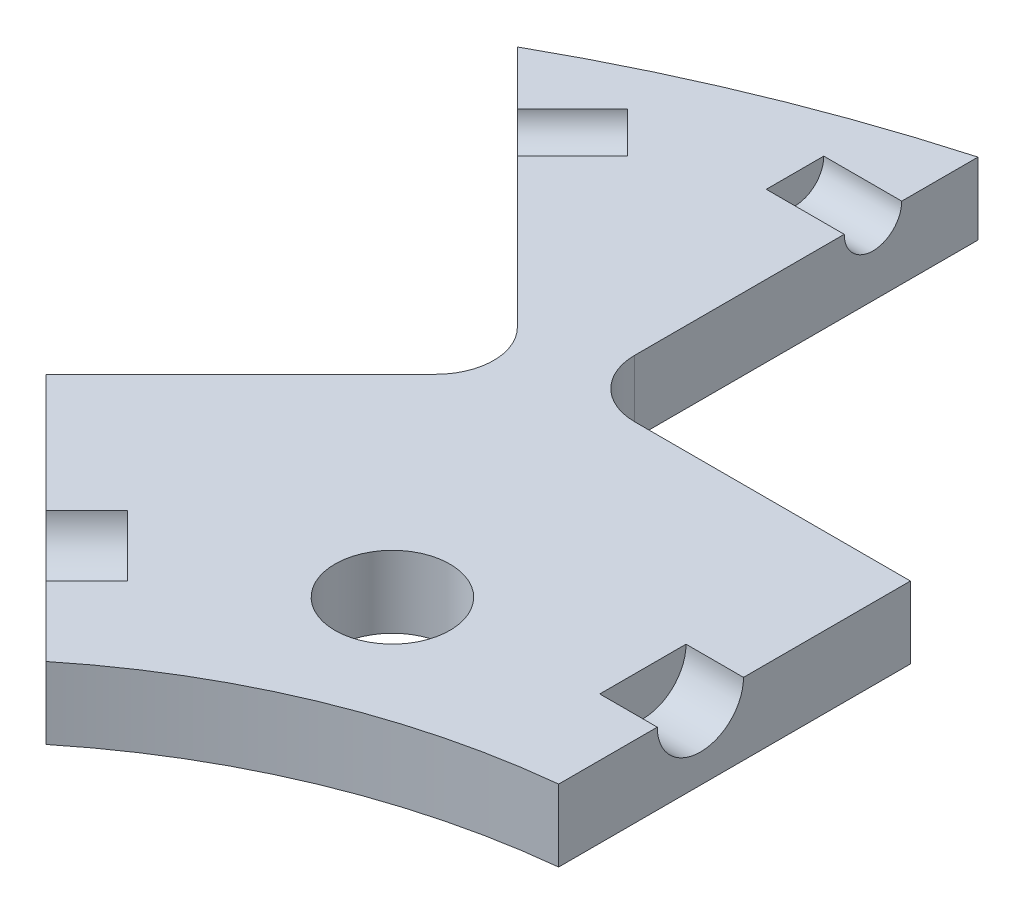
ISO-10303-21;
HEADER;
FILE_DESCRIPTION(('STEP AP214'),'2;1');
FILE_NAME('part.step','',(''),(''),'','','');
FILE_SCHEMA(('AUTOMOTIVE_DESIGN { 1 0 10303 214 1 1 1 1 }'));
ENDSEC;
DATA;
#1=APPLICATION_CONTEXT('core data for automotive mechanical design processes');
#2=APPLICATION_PROTOCOL_DEFINITION('international standard','automotive_design',2000,#1);
#3=PRODUCT_CONTEXT('',#1,'mechanical');
#4=PRODUCT('Part','Part','',(#3));
#5=PRODUCT_RELATED_PRODUCT_CATEGORY('part','',(#4));
#6=PRODUCT_DEFINITION_FORMATION('','',#4);
#7=PRODUCT_DEFINITION_CONTEXT('part definition',#1,'design');
#8=PRODUCT_DEFINITION('design','',#6,#7);
#9=PRODUCT_DEFINITION_SHAPE('','',#8);
#10=(LENGTH_UNIT() NAMED_UNIT(*) SI_UNIT(.MILLI.,.METRE.));
#11=(NAMED_UNIT(*) PLANE_ANGLE_UNIT() SI_UNIT($,.RADIAN.));
#12=(NAMED_UNIT(*) SI_UNIT($,.STERADIAN.) SOLID_ANGLE_UNIT());
#13=UNCERTAINTY_MEASURE_WITH_UNIT(LENGTH_MEASURE(1.E-05),#10,'distance_accuracy_value','');
#14=(GEOMETRIC_REPRESENTATION_CONTEXT(3) GLOBAL_UNCERTAINTY_ASSIGNED_CONTEXT((#13)) GLOBAL_UNIT_ASSIGNED_CONTEXT((#10,
#11,#12)) REPRESENTATION_CONTEXT('',''));
#15=CARTESIAN_POINT('',(0.,0.,0.));
#16=DIRECTION('',(0.,0.,1.));
#17=DIRECTION('',(1.,0.,0.));
#18=AXIS2_PLACEMENT_3D('',#15,#16,#17);
#19=CARTESIAN_POINT('',(-27.2775279677471,0.,-37.3803161039507));
#20=DIRECTION('',(0.707106781186556,0.,-0.707106781186539));
#21=DIRECTION('',(-0.707106781186539,0.,-0.707106781186556));
#22=AXIS2_PLACEMENT_3D('',#19,#20,#21);
#23=PLANE('',#22);
#24=DIRECTION('',(-0.707106781186539,0.,-0.707106781186556));
#25=VECTOR('',#24,1.);
#26=CARTESIAN_POINT('',(5.05139406810146,0.,-5.05139406810134));
#27=LINE('',#26,#25);
#28=CARTESIAN_POINT('',(-25.5937299450467,0.,-35.6965180812502));
#29=VERTEX_POINT('',#28);
#30=CARTESIAN_POINT('',(-28.9613259904475,0.,-39.0641141266512));
#31=VERTEX_POINT('',#30);
#32=EDGE_CURVE('E181',#29,#31,#27,.T.);
#33=ORIENTED_EDGE('',*,*,#32,.T.);
#34=CARTESIAN_POINT('',(-27.2775279677471,0.,-37.3803161039507));
#35=DIRECTION('',(0.707106781186556,0.,-0.707106781186539));
#36=DIRECTION('',(-0.707106781186539,0.,-0.707106781186556));
#37=AXIS2_PLACEMENT_3D('',#34,#35,#36);
#38=CIRCLE('',#37,2.38125);
#39=EDGE_CURVE('E169',#29,#31,#38,.T.);
#40=ORIENTED_EDGE('',*,*,#39,.F.);
#41=EDGE_LOOP('',(#33,#40));
#42=FACE_BOUND('',#41,.T.);
#43=ADVANCED_FACE('F40',(#42),#23,.F.);
#44=CARTESIAN_POINT('',(-29.1983725009799,-3.96875,-56.3536528991695));
#45=DIRECTION('',(0.,1.,0.));
#46=DIRECTION('',(0.,0.,1.));
#47=AXIS2_PLACEMENT_3D('',#44,#45,#46);
#48=CYLINDRICAL_SURFACE('',#47,3.175);
#49=CARTESIAN_POINT('',(-29.1983725009799,0.,-56.3536528991695));
#50=DIRECTION('',(0.,1.,0.));
#51=DIRECTION('',(0.,0.,1.));
#52=AXIS2_PLACEMENT_3D('',#49,#50,#51);
#53=CIRCLE('',#52,3.175);
#54=CARTESIAN_POINT('',(-26.9533084707125,0.,-58.5987169294368));
#55=VERTEX_POINT('',#54);
#56=CARTESIAN_POINT('',(-26.9533084707126,0.,-54.1085888689022));
#57=VERTEX_POINT('',#56);
#58=EDGE_CURVE('E304',#55,#57,#53,.F.);
#59=ORIENTED_EDGE('',*,*,#58,.F.);
#60=DIRECTION('',(0.,1.,0.));
#61=VECTOR('',#60,1.);
#62=CARTESIAN_POINT('',(-26.9533084707125,-3.96875,-58.5987169294368));
#63=LINE('',#62,#61);
#64=CARTESIAN_POINT('',(-26.9533084707125,-3.96875,-58.5987169294368));
#65=VERTEX_POINT('',#64);
#66=EDGE_CURVE('E224',#65,#55,#63,.T.);
#67=ORIENTED_EDGE('',*,*,#66,.F.);
#68=CARTESIAN_POINT('',(-29.1983725009799,-3.96875,-56.3536528991695));
#69=DIRECTION('',(0.,1.,0.));
#70=DIRECTION('',(0.707106781186539,0.,0.707106781186556));
#71=AXIS2_PLACEMENT_3D('',#68,#69,#70);
#72=CIRCLE('',#71,3.175);
#73=CARTESIAN_POINT('',(-26.9533084707126,-3.96875,-54.1085888689022));
#74=VERTEX_POINT('',#73);
#75=EDGE_CURVE('E261',#74,#65,#72,.T.);
#76=ORIENTED_EDGE('',*,*,#75,.F.);
#77=DIRECTION('',(0.,1.,0.));
#78=VECTOR('',#77,1.);
#79=CARTESIAN_POINT('',(-26.9533084707126,-3.96875,-54.1085888689022));
#80=LINE('',#79,#78);
#81=EDGE_CURVE('E188',#74,#57,#80,.T.);
#82=ORIENTED_EDGE('',*,*,#81,.T.);
#83=EDGE_LOOP('',(#59,#67,#76,#82));
#84=FACE_BOUND('',#83,.T.);
#85=ADVANCED_FACE('F369',(#84),#48,.F.);
#86=CARTESIAN_POINT('',(-33.2179673918339,0.,-70.9530036125678));
#87=DIRECTION('',(0.707106781186556,0.,-0.707106781186539));
#88=DIRECTION('',(-0.707106781186539,0.,-0.707106781186556));
#89=AXIS2_PLACEMENT_3D('',#86,#87,#88);
#90=PLANE('',#89);
#91=DIRECTION('',(0.707106781186539,0.,0.707106781186556));
#92=VECTOR('',#91,1.);
#93=CARTESIAN_POINT('',(-33.2179673918339,0.,-70.9530036125678));
#94=LINE('',#93,#92);
#95=CARTESIAN_POINT('',(-34.3404994069676,0.,-72.0755356277014));
#96=VERTEX_POINT('',#95);
#97=CARTESIAN_POINT('',(-32.0954353767003,0.,-69.8304715974341));
#98=VERTEX_POINT('',#97);
#99=EDGE_CURVE('E294',#96,#98,#94,.T.);
#100=ORIENTED_EDGE('',*,*,#99,.F.);
#101=CARTESIAN_POINT('',(-33.2179673918339,0.,-70.9530036125678));
#102=DIRECTION('',(0.707106781186556,0.,-0.707106781186539));
#103=DIRECTION('',(-0.707106781186539,0.,-0.707106781186556));
#104=AXIS2_PLACEMENT_3D('',#101,#102,#103);
#105=CIRCLE('',#104,1.5875);
#106=EDGE_CURVE('E195',#98,#96,#105,.T.);
#107=ORIENTED_EDGE('',*,*,#106,.F.);
#108=EDGE_LOOP('',(#100,#107));
#109=FACE_BOUND('',#108,.T.);
#110=ADVANCED_FACE('F416',(#109),#90,.F.);
#111=CARTESIAN_POINT('',(-70.953003612567,0.,-33.2179673918357));
#112=DIRECTION('',(0.707106781186556,0.,-0.707106781186539));
#113=DIRECTION('',(-0.707106781186539,0.,-0.707106781186556));
#114=AXIS2_PLACEMENT_3D('',#111,#112,#113);
#115=CYLINDRICAL_SURFACE('',#114,1.5875);
#116=DIRECTION('',(0.707106781186556,0.,-0.707106781186539));
#117=VECTOR('',#116,1.);
#118=CARTESIAN_POINT('',(-69.8304715974334,0.,-32.095435376702));
#119=LINE('',#118,#117);
#120=CARTESIAN_POINT('',(-35.140249257705,0.,-66.7856577164295));
#121=VERTEX_POINT('',#120);
#122=EDGE_CURVE('E298',#98,#121,#119,.F.);
#123=ORIENTED_EDGE('',*,*,#122,.F.);
#124=ORIENTED_EDGE('',*,*,#106,.T.);
#125=DIRECTION('',(0.707106781186556,0.,-0.707106781186539));
#126=VECTOR('',#125,1.);
#127=CARTESIAN_POINT('',(-72.0755356277006,0.,-34.3404994069693));
#128=LINE('',#127,#126);
#129=CARTESIAN_POINT('',(-37.3853132879723,0.,-69.0307217466968));
#130=VERTEX_POINT('',#129);
#131=EDGE_CURVE('E291',#130,#96,#128,.T.);
#132=ORIENTED_EDGE('',*,*,#131,.F.);
#133=CARTESIAN_POINT('',(-36.2627812728387,0.,-67.9081897315631));
#134=DIRECTION('',(0.707106781186557,0.,-0.707106781186538));
#135=DIRECTION('',(-0.707106781186538,0.,-0.707106781186557));
#136=AXIS2_PLACEMENT_3D('',#133,#134,#135);
#137=CIRCLE('',#136,1.5875);
#138=EDGE_CURVE('E219',#121,#130,#137,.T.);
#139=ORIENTED_EDGE('',*,*,#138,.F.);
#140=EDGE_LOOP('',(#123,#124,#132,#139));
#141=FACE_BOUND('',#140,.T.);
#142=ADVANCED_FACE('F475',(#141),#115,.F.);
#143=CARTESIAN_POINT('',(-40.3635332391684,-3.96875,-72.008941697893));
#144=DIRECTION('',(0.707106781186557,0.,-0.707106781186538));
#145=DIRECTION('',(-0.707106781186538,0.,-0.707106781186557));
#146=AXIS2_PLACEMENT_3D('',#143,#144,#145);
#147=PLANE('',#146);
#148=DIRECTION('',(0.707106781186538,0.,0.707106781186557));
#149=VECTOR('',#148,1.);
#150=CARTESIAN_POINT('',(-40.3635332391684,0.,-72.008941697893));
#151=LINE('',#150,#149);
#152=CARTESIAN_POINT('',(-40.3635332391684,0.,-72.008941697893));
#153=VERTEX_POINT('',#152);
#154=EDGE_CURVE('E295',#153,#130,#151,.T.);
#155=ORIENTED_EDGE('',*,*,#154,.F.);
#156=DIRECTION('',(0.,1.,0.));
#157=VECTOR('',#156,1.);
#158=CARTESIAN_POINT('',(-40.3635332391684,-3.96875,-72.008941697893));
#159=LINE('',#158,#157);
#160=CARTESIAN_POINT('',(-40.3635332391684,-3.96875,-72.008941697893));
#161=VERTEX_POINT('',#160);
#162=EDGE_CURVE('E253',#161,#153,#159,.T.);
#163=ORIENTED_EDGE('',*,*,#162,.F.);
#164=DIRECTION('',(-0.707106781186538,0.,-0.707106781186557));
#165=VECTOR('',#164,1.);
#166=CARTESIAN_POINT('',(-40.3635332391684,-3.96875,-72.008941697893));
#167=LINE('',#166,#165);
#168=EDGE_CURVE('E249',#65,#161,#167,.T.);
#169=ORIENTED_EDGE('',*,*,#168,.F.);
#170=ORIENTED_EDGE('',*,*,#66,.T.);
#171=EDGE_CURVE('E301',#121,#55,#151,.T.);
#172=ORIENTED_EDGE('',*,*,#171,.F.);
#173=ORIENTED_EDGE('',*,*,#138,.T.);
#174=EDGE_LOOP('',(#155,#163,#169,#170,#172,#173));
#175=FACE_BOUND('',#174,.T.);
#176=ADVANCED_FACE('F373',(#175),#147,.F.);
#177=CARTESIAN_POINT('',(0.,3.96875,0.));
#178=DIRECTION('',(0.,-1.,0.));
#179=DIRECTION('',(0.,0.,-1.));
#180=AXIS2_PLACEMENT_3D('',#177,#178,#179);
#181=CYLINDRICAL_SURFACE('',#180,82.55);
#182=CARTESIAN_POINT('',(0.,0.,0.));
#183=DIRECTION('',(0.,1.,0.));
#184=DIRECTION('',(0.,0.,1.));
#185=AXIS2_PLACEMENT_3D('',#182,#183,#184);
#186=CIRCLE('',#185,82.55);
#187=CARTESIAN_POINT('',(-22.3766829145813,0.,-79.4593390467117));
#188=VERTEX_POINT('',#187);
#189=EDGE_CURVE('E44',#188,#153,#186,.T.);
#190=ORIENTED_EDGE('',*,*,#189,.F.);
#191=DIRECTION('',(0.,1.,0.));
#192=VECTOR('',#191,1.);
#193=CARTESIAN_POINT('',(-22.3766829145813,-3.96875,-79.4593390467117));
#194=LINE('',#193,#192);
#195=CARTESIAN_POINT('',(-22.3766829145813,-3.96875,-79.4593390467117));
#196=VERTEX_POINT('',#195);
#197=EDGE_CURVE('E225',#196,#188,#194,.T.);
#198=ORIENTED_EDGE('',*,*,#197,.F.);
#199=CARTESIAN_POINT('',(0.,-3.96875,0.));
#200=DIRECTION('',(0.,1.,0.));
#201=DIRECTION('',(0.,0.,1.));
#202=AXIS2_PLACEMENT_3D('',#199,#200,#201);
#203=CIRCLE('',#202,82.55);
#204=EDGE_CURVE('E223',#196,#161,#203,.T.);
#205=ORIENTED_EDGE('',*,*,#204,.T.);
#206=ORIENTED_EDGE('',*,*,#162,.T.);
#207=EDGE_LOOP('',(#190,#198,#205,#206));
#208=FACE_BOUND('',#207,.T.);
#209=ADVANCED_FACE('F376',(#208),#181,.T.);
#210=CARTESIAN_POINT('',(-26.6827,0.,-73.66));
#211=DIRECTION('',(1.,0.,0.));
#212=DIRECTION('',(0.,0.,-1.));
#213=AXIS2_PLACEMENT_3D('',#210,#211,#212);
#214=PLANE('',#213);
#215=CARTESIAN_POINT('',(-26.6827,0.,-73.66));
#216=DIRECTION('',(1.,0.,0.));
#217=DIRECTION('',(0.,0.,-1.));
#218=AXIS2_PLACEMENT_3D('',#215,#216,#217);
#219=CIRCLE('',#218,1.5875);
#220=CARTESIAN_POINT('',(-26.6827,0.,-72.0725));
#221=VERTEX_POINT('',#220);
#222=CARTESIAN_POINT('',(-26.6827,0.,-75.2475));
#223=VERTEX_POINT('',#222);
#224=EDGE_CURVE('E256',#221,#223,#219,.T.);
#225=ORIENTED_EDGE('',*,*,#224,.T.);
#226=DIRECTION('',(0.,0.,1.));
#227=VECTOR('',#226,1.);
#228=CARTESIAN_POINT('',(-26.6827,0.,-73.66));
#229=LINE('',#228,#227);
#230=EDGE_CURVE('E230',#223,#221,#229,.T.);
#231=ORIENTED_EDGE('',*,*,#230,.T.);
#232=EDGE_LOOP('',(#225,#231));
#233=FACE_BOUND('',#232,.T.);
#234=ADVANCED_FACE('F423',(#233),#214,.T.);
#235=CARTESIAN_POINT('',(-26.6827,0.,-73.66));
#236=DIRECTION('',(1.,0.,0.));
#237=DIRECTION('',(0.,0.,-1.));
#238=AXIS2_PLACEMENT_3D('',#235,#236,#237);
#239=CYLINDRICAL_SURFACE('',#238,1.5875);
#240=DIRECTION('',(1.,0.,0.));
#241=VECTOR('',#240,1.);
#242=CARTESIAN_POINT('',(-26.6827,0.,-72.0725));
#243=LINE('',#242,#241);
#244=CARTESIAN_POINT('',(-22.3766829145813,0.,-72.0725));
#245=VERTEX_POINT('',#244);
#246=EDGE_CURVE('E283',#245,#221,#243,.F.);
#247=ORIENTED_EDGE('',*,*,#246,.F.);
#248=CARTESIAN_POINT('',(-22.3766829145813,0.,-73.66));
#249=DIRECTION('',(-1.,0.,0.));
#250=DIRECTION('',(0.,0.,1.));
#251=AXIS2_PLACEMENT_3D('',#248,#249,#250);
#252=CIRCLE('',#251,1.5875);
#253=CARTESIAN_POINT('',(-22.3766829145813,0.,-75.2475));
#254=VERTEX_POINT('',#253);
#255=EDGE_CURVE('E229',#254,#245,#252,.T.);
#256=ORIENTED_EDGE('',*,*,#255,.F.);
#257=DIRECTION('',(1.,0.,0.));
#258=VECTOR('',#257,1.);
#259=CARTESIAN_POINT('',(-26.6827,0.,-75.2475));
#260=LINE('',#259,#258);
#261=EDGE_CURVE('E282',#223,#254,#260,.T.);
#262=ORIENTED_EDGE('',*,*,#261,.F.);
#263=ORIENTED_EDGE('',*,*,#224,.F.);
#264=EDGE_LOOP('',(#247,#256,#262,#263));
#265=FACE_BOUND('',#264,.T.);
#266=ADVANCED_FACE('F420',(#265),#239,.F.);
#267=CARTESIAN_POINT('',(-22.3766829145813,-3.96875,-79.4593390467117));
#268=DIRECTION('',(-1.,0.,0.));
#269=DIRECTION('',(0.,0.,1.));
#270=AXIS2_PLACEMENT_3D('',#267,#268,#269);
#271=PLANE('',#270);
#272=DIRECTION('',(0.,0.,-1.));
#273=VECTOR('',#272,1.);
#274=CARTESIAN_POINT('',(-22.3766829145813,0.,-79.4593390467117));
#275=LINE('',#274,#273);
#276=CARTESIAN_POINT('',(-22.3766829145813,0.,-60.4944173046896));
#277=VERTEX_POINT('',#276);
#278=EDGE_CURVE('E278',#277,#245,#275,.T.);
#279=ORIENTED_EDGE('',*,*,#278,.F.);
#280=DIRECTION('',(0.,1.,0.));
#281=VECTOR('',#280,1.);
#282=CARTESIAN_POINT('',(-22.3766829145813,-3.96875,-60.4944173046896));
#283=LINE('',#282,#281);
#284=CARTESIAN_POINT('',(-22.3766829145813,-3.96875,-60.4944173046896));
#285=VERTEX_POINT('',#284);
#286=EDGE_CURVE('E231',#285,#277,#283,.T.);
#287=ORIENTED_EDGE('',*,*,#286,.F.);
#288=DIRECTION('',(0.,0.,1.));
#289=VECTOR('',#288,1.);
#290=CARTESIAN_POINT('',(-22.3766829145813,-3.96875,-79.4593390467117));
#291=LINE('',#290,#289);
#292=EDGE_CURVE('E245',#196,#285,#291,.T.);
#293=ORIENTED_EDGE('',*,*,#292,.F.);
#294=ORIENTED_EDGE('',*,*,#197,.T.);
#295=EDGE_CURVE('E279',#254,#188,#275,.T.);
#296=ORIENTED_EDGE('',*,*,#295,.F.);
#297=ORIENTED_EDGE('',*,*,#255,.T.);
#298=EDGE_LOOP('',(#279,#287,#293,#294,#296,#297));
#299=FACE_BOUND('',#298,.T.);
#300=ADVANCED_FACE('F381',(#299),#271,.F.);
#301=CARTESIAN_POINT('',(-19.2016829145813,-3.96875,-60.4944173046896));
#302=DIRECTION('',(0.,1.,0.));
#303=DIRECTION('',(0.,0.,1.));
#304=AXIS2_PLACEMENT_3D('',#301,#302,#303);
#305=CYLINDRICAL_SURFACE('',#304,3.175);
#306=CARTESIAN_POINT('',(-19.2016829145813,0.,-60.4944173046896));
#307=DIRECTION('',(0.,1.,0.));
#308=DIRECTION('',(0.,0.,1.));
#309=AXIS2_PLACEMENT_3D('',#306,#307,#308);
#310=CIRCLE('',#309,3.175);
#311=CARTESIAN_POINT('',(-19.2016829145813,0.,-57.3194173046896));
#312=VERTEX_POINT('',#311);
#313=EDGE_CURVE('E275',#312,#277,#310,.F.);
#314=ORIENTED_EDGE('',*,*,#313,.F.);
#315=DIRECTION('',(0.,1.,0.));
#316=VECTOR('',#315,1.);
#317=CARTESIAN_POINT('',(-19.2016829145813,-3.96875,-57.3194173046896));
#318=LINE('',#317,#316);
#319=CARTESIAN_POINT('',(-19.2016829145813,-3.96875,-57.3194173046896));
#320=VERTEX_POINT('',#319);
#321=EDGE_CURVE('E236',#320,#312,#318,.T.);
#322=ORIENTED_EDGE('',*,*,#321,.F.);
#323=CARTESIAN_POINT('',(-19.2016829145813,-3.96875,-60.4944173046896));
#324=DIRECTION('',(0.,1.,0.));
#325=DIRECTION('',(0.,0.,-1.));
#326=AXIS2_PLACEMENT_3D('',#323,#324,#325);
#327=CIRCLE('',#326,3.175);
#328=EDGE_CURVE('E241',#285,#320,#327,.T.);
#329=ORIENTED_EDGE('',*,*,#328,.F.);
#330=ORIENTED_EDGE('',*,*,#286,.T.);
#331=EDGE_LOOP('',(#314,#322,#329,#330));
#332=FACE_BOUND('',#331,.T.);
#333=ADVANCED_FACE('F385',(#332),#305,.F.);
#334=CARTESIAN_POINT('',(-7.14375,0.,-45.72));
#335=DIRECTION('',(1.,0.,0.));
#336=DIRECTION('',(0.,0.,-1.));
#337=AXIS2_PLACEMENT_3D('',#334,#335,#336);
#338=PLANE('',#337);
#339=CARTESIAN_POINT('',(-7.14375,0.,-45.72));
#340=DIRECTION('',(1.,0.,0.));
#341=DIRECTION('',(0.,0.,-1.));
#342=AXIS2_PLACEMENT_3D('',#339,#340,#341);
#343=CIRCLE('',#342,2.38125);
#344=CARTESIAN_POINT('',(-7.14375,0.,-43.33875));
#345=VERTEX_POINT('',#344);
#346=CARTESIAN_POINT('',(-7.14375,0.,-48.10125));
#347=VERTEX_POINT('',#346);
#348=EDGE_CURVE('E235',#345,#347,#343,.T.);
#349=ORIENTED_EDGE('',*,*,#348,.T.);
#350=DIRECTION('',(0.,0.,-1.));
#351=VECTOR('',#350,1.);
#352=CARTESIAN_POINT('',(-7.14375,0.,0.));
#353=LINE('',#352,#351);
#354=EDGE_CURVE('E208',#345,#347,#353,.T.);
#355=ORIENTED_EDGE('',*,*,#354,.F.);
#356=EDGE_LOOP('',(#349,#355));
#357=FACE_BOUND('',#356,.T.);
#358=ADVANCED_FACE('F400',(#357),#338,.T.);
#359=CARTESIAN_POINT('',(-7.14375,0.,-45.72));
#360=DIRECTION('',(1.,0.,0.));
#361=DIRECTION('',(0.,0.,-1.));
#362=AXIS2_PLACEMENT_3D('',#359,#360,#361);
#363=CYLINDRICAL_SURFACE('',#362,2.38125);
#364=DIRECTION('',(1.,0.,0.));
#365=VECTOR('',#364,1.);
#366=CARTESIAN_POINT('',(-7.14375,0.,-43.33875));
#367=LINE('',#366,#365);
#368=CARTESIAN_POINT('',(-3.96875,0.,-43.33875));
#369=VERTEX_POINT('',#368);
#370=EDGE_CURVE('E326',#345,#369,#367,.T.);
#371=ORIENTED_EDGE('',*,*,#370,.T.);
#372=CARTESIAN_POINT('',(-3.96875,0.,-45.72));
#373=DIRECTION('',(-1.,0.,0.));
#374=DIRECTION('',(0.,0.,1.));
#375=AXIS2_PLACEMENT_3D('',#372,#373,#374);
#376=CIRCLE('',#375,2.38125);
#377=CARTESIAN_POINT('',(-3.96875,0.,-48.10125));
#378=VERTEX_POINT('',#377);
#379=EDGE_CURVE('E213',#378,#369,#376,.T.);
#380=ORIENTED_EDGE('',*,*,#379,.F.);
#381=DIRECTION('',(1.,0.,0.));
#382=VECTOR('',#381,1.);
#383=CARTESIAN_POINT('',(-7.14375,0.,-48.10125));
#384=LINE('',#383,#382);
#385=EDGE_CURVE('E315',#378,#347,#384,.F.);
#386=ORIENTED_EDGE('',*,*,#385,.T.);
#387=ORIENTED_EDGE('',*,*,#348,.F.);
#388=EDGE_LOOP('',(#371,#380,#386,#387));
#389=FACE_BOUND('',#388,.T.);
#390=ADVANCED_FACE('F398',(#389),#363,.F.);
#391=CARTESIAN_POINT('',(19.2016829145813,-3.96875,-57.3194173046896));
#392=DIRECTION('',(0.,0.,1.));
#393=DIRECTION('',(1.,0.,0.));
#394=AXIS2_PLACEMENT_3D('',#391,#392,#393);
#395=PLANE('',#394);
#396=DIRECTION('',(-1.,0.,0.));
#397=VECTOR('',#396,1.);
#398=CARTESIAN_POINT('',(19.2016829145813,0.,-57.3194173046896));
#399=LINE('',#398,#397);
#400=CARTESIAN_POINT('',(-3.96875,0.,-57.3194173046896));
#401=VERTEX_POINT('',#400);
#402=EDGE_CURVE('E212',#401,#312,#399,.T.);
#403=ORIENTED_EDGE('',*,*,#402,.F.);
#404=DIRECTION('',(0.,-1.,0.));
#405=VECTOR('',#404,1.);
#406=CARTESIAN_POINT('',(-3.96875,-3.96875,-57.3194173046896));
#407=LINE('',#406,#405);
#408=CARTESIAN_POINT('',(-3.96875,-3.96875,-57.3194173046896));
#409=VERTEX_POINT('',#408);
#410=EDGE_CURVE('E240',#401,#409,#407,.T.);
#411=ORIENTED_EDGE('',*,*,#410,.T.);
#412=DIRECTION('',(1.,0.,0.));
#413=VECTOR('',#412,1.);
#414=CARTESIAN_POINT('',(19.2016829145813,-3.96875,-57.3194173046896));
#415=LINE('',#414,#413);
#416=EDGE_CURVE('E51',#320,#409,#415,.T.);
#417=ORIENTED_EDGE('',*,*,#416,.F.);
#418=ORIENTED_EDGE('',*,*,#321,.T.);
#419=EDGE_LOOP('',(#403,#411,#417,#418));
#420=FACE_BOUND('',#419,.T.);
#421=ADVANCED_FACE('F389',(#420),#395,.F.);
#422=CARTESIAN_POINT('',(-26.9533084707126,-3.96875,-54.1085888689022));
#423=DIRECTION('',(0.707106781186539,0.,0.707106781186556));
#424=DIRECTION('',(0.707106781186556,0.,-0.707106781186539));
#425=AXIS2_PLACEMENT_3D('',#422,#423,#424);
#426=PLANE('',#425);
#427=DIRECTION('',(0.707106781186556,0.,-0.707106781186539));
#428=VECTOR('',#427,1.);
#429=CARTESIAN_POINT('',(-26.9533084707126,-3.96875,-54.1085888689022));
#430=LINE('',#429,#428);
#431=CARTESIAN_POINT('',(-37.7246186319729,-3.96875,-43.3372787076421));
#432=VERTEX_POINT('',#431);
#433=EDGE_CURVE('E265',#432,#74,#430,.T.);
#434=ORIENTED_EDGE('',*,*,#433,.F.);
#435=DIRECTION('',(0.,1.,0.));
#436=VECTOR('',#435,1.);
#437=CARTESIAN_POINT('',(-37.7246186319729,-3.96875,-43.3372787076421));
#438=LINE('',#437,#436);
#439=CARTESIAN_POINT('',(-37.7246186319729,0.,-43.3372787076421));
#440=VERTEX_POINT('',#439);
#441=EDGE_CURVE('E177',#432,#440,#438,.T.);
#442=ORIENTED_EDGE('',*,*,#441,.T.);
#443=DIRECTION('',(-0.707106781186556,0.,0.707106781186539));
#444=VECTOR('',#443,1.);
#445=CARTESIAN_POINT('',(-26.9533084707126,0.,-54.1085888689022));
#446=LINE('',#445,#444);
#447=EDGE_CURVE('E307',#57,#440,#446,.T.);
#448=ORIENTED_EDGE('',*,*,#447,.F.);
#449=ORIENTED_EDGE('',*,*,#81,.F.);
#450=EDGE_LOOP('',(#434,#442,#448,#449));
#451=FACE_BOUND('',#450,.T.);
#452=ADVANCED_FACE('F363',(#451),#426,.F.);
#453=CARTESIAN_POINT('',(-37.38031610395,0.,-27.277527967748));
#454=DIRECTION('',(0.707106781186556,0.,-0.707106781186539));
#455=DIRECTION('',(-0.707106781186539,0.,-0.707106781186556));
#456=AXIS2_PLACEMENT_3D('',#453,#454,#455);
#457=CYLINDRICAL_SURFACE('',#456,2.38125);
#458=DIRECTION('',(0.707106781186556,0.,-0.707106781186539));
#459=VECTOR('',#458,1.);
#460=CARTESIAN_POINT('',(-35.6965180812496,0.,-25.5937299450475));
#461=LINE('',#460,#459);
#462=CARTESIAN_POINT('',(-27.838793975314,0.,-33.4514540509829));
#463=VERTEX_POINT('',#462);
#464=EDGE_CURVE('E166',#463,#29,#461,.T.);
#465=ORIENTED_EDGE('',*,*,#464,.T.);
#466=ORIENTED_EDGE('',*,*,#39,.T.);
#467=DIRECTION('',(0.707106781186556,0.,-0.707106781186539));
#468=VECTOR('',#467,1.);
#469=CARTESIAN_POINT('',(-39.0641141266505,0.,-28.9613259904485));
#470=LINE('',#469,#468);
#471=CARTESIAN_POINT('',(-31.2063900207149,0.,-36.8190500963839));
#472=VERTEX_POINT('',#471);
#473=EDGE_CURVE('E183',#31,#472,#470,.F.);
#474=ORIENTED_EDGE('',*,*,#473,.T.);
#475=CARTESIAN_POINT('',(-29.5225919980144,0.,-35.1352520736834));
#476=DIRECTION('',(0.707106781186556,0.,-0.707106781186539));
#477=DIRECTION('',(-0.707106781186539,0.,-0.707106781186556));
#478=AXIS2_PLACEMENT_3D('',#475,#476,#477);
#479=CIRCLE('',#478,2.38125);
#480=EDGE_CURVE('E172',#463,#472,#479,.T.);
#481=ORIENTED_EDGE('',*,*,#480,.F.);
#482=EDGE_LOOP('',(#465,#466,#474,#481));
#483=FACE_BOUND('',#482,.T.);
#484=ADVANCED_FACE('F168',(#483),#457,.F.);
#485=CARTESIAN_POINT('',(-15.2739783293003,-3.96875,-20.886638404969));
#486=DIRECTION('',(0.707106781186556,0.,-0.707106781186539));
#487=DIRECTION('',(-0.707106781186539,0.,-0.707106781186556));
#488=AXIS2_PLACEMENT_3D('',#485,#486,#487);
#489=PLANE('',#488);
#490=DIRECTION('',(-0.707106781186539,0.,-0.707106781186556));
#491=VECTOR('',#490,1.);
#492=CARTESIAN_POINT('',(-15.2739783293003,-3.96875,-20.886638404969));
#493=LINE('',#492,#491);
#494=CARTESIAN_POINT('',(-23.9878766441845,-3.96875,-29.6005367198534));
#495=VERTEX_POINT('',#494);
#496=EDGE_CURVE('E330',#495,#432,#493,.T.);
#497=ORIENTED_EDGE('',*,*,#496,.F.);
#498=DIRECTION('',(0.,1.,0.));
#499=VECTOR('',#498,1.);
#500=CARTESIAN_POINT('',(-23.9878766441845,-3.96875,-29.6005367198534));
#501=LINE('',#500,#499);
#502=CARTESIAN_POINT('',(-23.9878766441845,0.,-29.6005367198534));
#503=VERTEX_POINT('',#502);
#504=EDGE_CURVE('E67',#495,#503,#501,.T.);
#505=ORIENTED_EDGE('',*,*,#504,.T.);
#506=DIRECTION('',(-0.707106781186539,0.,-0.707106781186556));
#507=VECTOR('',#506,1.);
#508=CARTESIAN_POINT('',(2.80633003783414,0.,-2.80633003783407));
#509=LINE('',#508,#507);
#510=EDGE_CURVE('E205',#503,#463,#509,.T.);
#511=ORIENTED_EDGE('',*,*,#510,.T.);
#512=ORIENTED_EDGE('',*,*,#480,.T.);
#513=EDGE_CURVE('E204',#472,#440,#509,.T.);
#514=ORIENTED_EDGE('',*,*,#513,.T.);
#515=ORIENTED_EDGE('',*,*,#441,.F.);
#516=EDGE_LOOP('',(#497,#505,#511,#512,#514,#515));
#517=FACE_BOUND('',#516,.T.);
#518=ADVANCED_FACE('F358',(#517),#489,.F.);
#519=CARTESIAN_POINT('',(-3.96875,-3.96875,-25.5694173046896));
#520=DIRECTION('',(-1.,0.,0.));
#521=DIRECTION('',(0.,0.,1.));
#522=AXIS2_PLACEMENT_3D('',#519,#520,#521);
#523=PLANE('',#522);
#524=DIRECTION('',(0.,0.,1.));
#525=VECTOR('',#524,1.);
#526=CARTESIAN_POINT('',(-3.96875,0.,0.));
#527=LINE('',#526,#525);
#528=CARTESIAN_POINT('',(-3.96875,0.,-37.892730482739));
#529=VERTEX_POINT('',#528);
#530=EDGE_CURVE('E218',#369,#529,#527,.T.);
#531=ORIENTED_EDGE('',*,*,#530,.T.);
#532=DIRECTION('',(0.,1.,0.));
#533=VECTOR('',#532,1.);
#534=CARTESIAN_POINT('',(-3.96875,-3.96875,-37.892730482739));
#535=LINE('',#534,#533);
#536=CARTESIAN_POINT('',(-3.96875,-3.96875,-37.892730482739));
#537=VERTEX_POINT('',#536);
#538=EDGE_CURVE('E58',#529,#537,#535,.F.);
#539=ORIENTED_EDGE('',*,*,#538,.T.);
#540=DIRECTION('',(0.,0.,1.));
#541=VECTOR('',#540,1.);
#542=CARTESIAN_POINT('',(-3.96875,-3.96875,-25.5694173046896));
#543=LINE('',#542,#541);
#544=EDGE_CURVE('E311',#409,#537,#543,.T.);
#545=ORIENTED_EDGE('',*,*,#544,.F.);
#546=ORIENTED_EDGE('',*,*,#410,.F.);
#547=EDGE_CURVE('E214',#401,#378,#527,.T.);
#548=ORIENTED_EDGE('',*,*,#547,.T.);
#549=ORIENTED_EDGE('',*,*,#379,.T.);
#550=EDGE_LOOP('',(#531,#539,#545,#546,#548,#549));
#551=FACE_BOUND('',#550,.T.);
#552=ADVANCED_FACE('F393',(#551),#523,.F.);
#553=CARTESIAN_POINT('',(0.,0.,0.));
#554=DIRECTION('',(0.,1.,0.));
#555=DIRECTION('',(0.,0.,1.));
#556=AXIS2_PLACEMENT_3D('',#553,#554,#555);
#557=PLANE('',#556);
#558=CARTESIAN_POINT('',(-17.4962865277316,0.,-42.2397722264161));
#559=DIRECTION('',(0.,1.,0.));
#560=DIRECTION('',(0.,0.,1.));
#561=AXIS2_PLACEMENT_3D('',#558,#559,#560);
#562=CIRCLE('',#561,3.175);
#563=CARTESIAN_POINT('',(-17.4962865277316,0.,-39.0647722264161));
#564=VERTEX_POINT('',#563);
#565=EDGE_CURVE('E189',#564,#564,#562,.T.);
#566=ORIENTED_EDGE('',*,*,#565,.F.);
#567=EDGE_LOOP('',(#566));
#568=FACE_BOUND('',#567,.T.);
#569=CARTESIAN_POINT('',(0.,0.,0.));
#570=DIRECTION('',(0.,1.,0.));
#571=DIRECTION('',(0.,0.,1.));
#572=AXIS2_PLACEMENT_3D('',#569,#570,#571);
#573=CIRCLE('',#572,38.1);
#574=EDGE_CURVE('E11',#529,#503,#573,.T.);
#575=ORIENTED_EDGE('',*,*,#574,.F.);
#576=ORIENTED_EDGE('',*,*,#530,.F.);
#577=ORIENTED_EDGE('',*,*,#370,.F.);
#578=ORIENTED_EDGE('',*,*,#354,.T.);
#579=ORIENTED_EDGE('',*,*,#385,.F.);
#580=ORIENTED_EDGE('',*,*,#547,.F.);
#581=ORIENTED_EDGE('',*,*,#402,.T.);
#582=ORIENTED_EDGE('',*,*,#313,.T.);
#583=ORIENTED_EDGE('',*,*,#278,.T.);
#584=ORIENTED_EDGE('',*,*,#246,.T.);
#585=ORIENTED_EDGE('',*,*,#230,.F.);
#586=ORIENTED_EDGE('',*,*,#261,.T.);
#587=ORIENTED_EDGE('',*,*,#295,.T.);
#588=ORIENTED_EDGE('',*,*,#189,.T.);
#589=ORIENTED_EDGE('',*,*,#154,.T.);
#590=ORIENTED_EDGE('',*,*,#131,.T.);
#591=ORIENTED_EDGE('',*,*,#99,.T.);
#592=ORIENTED_EDGE('',*,*,#122,.T.);
#593=ORIENTED_EDGE('',*,*,#171,.T.);
#594=ORIENTED_EDGE('',*,*,#58,.T.);
#595=ORIENTED_EDGE('',*,*,#447,.T.);
#596=ORIENTED_EDGE('',*,*,#513,.F.);
#597=ORIENTED_EDGE('',*,*,#473,.F.);
#598=ORIENTED_EDGE('',*,*,#32,.F.);
#599=ORIENTED_EDGE('',*,*,#464,.F.);
#600=ORIENTED_EDGE('',*,*,#510,.F.);
#601=EDGE_LOOP('',(#575,#576,#577,#578,#579,#580,#581,#582,#583,#584,#585,#586,#587,#588,#589,
#590,#591,#592,#593,#594,#595,#596,#597,#598,#599,#600));
#602=FACE_BOUND('',#601,.T.);
#603=ADVANCED_FACE('F185',(#568,#602),#557,.T.);
#604=CARTESIAN_POINT('',(0.,-3.96875,0.));
#605=DIRECTION('',(0.,1.,0.));
#606=DIRECTION('',(0.,0.,1.));
#607=AXIS2_PLACEMENT_3D('',#604,#605,#606);
#608=PLANE('',#607);
#609=CARTESIAN_POINT('',(-17.4962865277316,-3.96875,-42.2397722264161));
#610=DIRECTION('',(0.,1.,0.));
#611=DIRECTION('',(0.,0.,1.));
#612=AXIS2_PLACEMENT_3D('',#609,#610,#611);
#613=CIRCLE('',#612,3.175);
#614=CARTESIAN_POINT('',(-17.4962865277316,-3.96875,-39.0647722264161));
#615=VERTEX_POINT('',#614);
#616=EDGE_CURVE('E198',#615,#615,#613,.T.);
#617=ORIENTED_EDGE('',*,*,#616,.T.);
#618=EDGE_LOOP('',(#617));
#619=FACE_BOUND('',#618,.T.);
#620=ORIENTED_EDGE('',*,*,#544,.T.);
#621=CARTESIAN_POINT('',(0.,-3.96875,0.));
#622=DIRECTION('',(0.,1.,0.));
#623=DIRECTION('',(0.,0.,1.));
#624=AXIS2_PLACEMENT_3D('',#621,#622,#623);
#625=CIRCLE('',#624,38.1);
#626=EDGE_CURVE('E319',#537,#495,#625,.T.);
#627=ORIENTED_EDGE('',*,*,#626,.T.);
#628=ORIENTED_EDGE('',*,*,#496,.T.);
#629=ORIENTED_EDGE('',*,*,#433,.T.);
#630=ORIENTED_EDGE('',*,*,#75,.T.);
#631=ORIENTED_EDGE('',*,*,#168,.T.);
#632=ORIENTED_EDGE('',*,*,#204,.F.);
#633=ORIENTED_EDGE('',*,*,#292,.T.);
#634=ORIENTED_EDGE('',*,*,#328,.T.);
#635=ORIENTED_EDGE('',*,*,#416,.T.);
#636=EDGE_LOOP('',(#620,#627,#628,#629,#630,#631,#632,#633,#634,#635));
#637=FACE_BOUND('',#636,.T.);
#638=ADVANCED_FACE('F42',(#619,#637),#608,.F.);
#639=CARTESIAN_POINT('',(0.,-3.96875,0.));
#640=DIRECTION('',(0.,1.,0.));
#641=DIRECTION('',(0.,0.,1.));
#642=AXIS2_PLACEMENT_3D('',#639,#640,#641);
#643=CYLINDRICAL_SURFACE('',#642,38.1);
#644=ORIENTED_EDGE('',*,*,#574,.T.);
#645=ORIENTED_EDGE('',*,*,#504,.F.);
#646=ORIENTED_EDGE('',*,*,#626,.F.);
#647=ORIENTED_EDGE('',*,*,#538,.F.);
#648=EDGE_LOOP('',(#644,#645,#646,#647));
#649=FACE_BOUND('',#648,.T.);
#650=ADVANCED_FACE('F427',(#649),#643,.F.);
#651=CARTESIAN_POINT('',(-17.4962865277316,-3.96875,-42.2397722264161));
#652=DIRECTION('',(0.,1.,0.));
#653=DIRECTION('',(0.,0.,1.));
#654=AXIS2_PLACEMENT_3D('',#651,#652,#653);
#655=CYLINDRICAL_SURFACE('',#654,3.175);
#656=ORIENTED_EDGE('',*,*,#565,.T.);
#657=EDGE_LOOP('',(#656));
#658=FACE_BOUND('',#657,.T.);
#659=ORIENTED_EDGE('',*,*,#616,.F.);
#660=EDGE_LOOP('',(#659));
#661=FACE_BOUND('',#660,.T.);
#662=ADVANCED_FACE('F430',(#658,#661),#655,.F.);
#663=CLOSED_SHELL('',(#43,#85,#110,#142,#176,#209,#234,#266,#300,#333,#358,#390,#421,#452,#484,
#518,#552,#603,#638,#650,#662));
#664=MANIFOLD_SOLID_BREP('B2',#663);
#665=ADVANCED_BREP_SHAPE_REPRESENTATION('',(#18,#664),#14);
#666=SHAPE_DEFINITION_REPRESENTATION(#9,#665);
ENDSEC;
END-ISO-10303-21;
